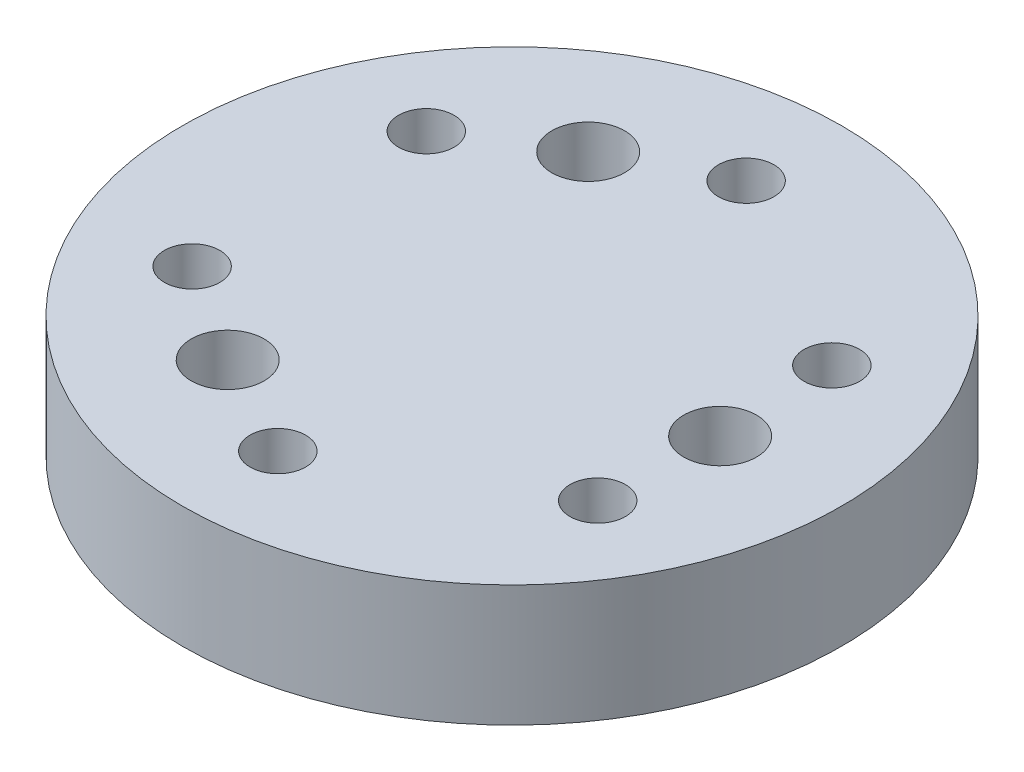
ISO-10303-21;
HEADER;
FILE_DESCRIPTION(('STEP AP214'),'2;1');
FILE_NAME('part.step','',(''),(''),'','','');
FILE_SCHEMA(('AUTOMOTIVE_DESIGN { 1 0 10303 214 1 1 1 1 }'));
ENDSEC;
DATA;
#1=APPLICATION_CONTEXT('core data for automotive mechanical design processes');
#2=APPLICATION_PROTOCOL_DEFINITION('international standard','automotive_design',2000,#1);
#3=PRODUCT_CONTEXT('',#1,'mechanical');
#4=PRODUCT('Part','Part','',(#3));
#5=PRODUCT_RELATED_PRODUCT_CATEGORY('part','',(#4));
#6=PRODUCT_DEFINITION_FORMATION('','',#4);
#7=PRODUCT_DEFINITION_CONTEXT('part definition',#1,'design');
#8=PRODUCT_DEFINITION('design','',#6,#7);
#9=PRODUCT_DEFINITION_SHAPE('','',#8);
#10=(LENGTH_UNIT() NAMED_UNIT(*) SI_UNIT(.MILLI.,.METRE.));
#11=(NAMED_UNIT(*) PLANE_ANGLE_UNIT() SI_UNIT($,.RADIAN.));
#12=(NAMED_UNIT(*) SI_UNIT($,.STERADIAN.) SOLID_ANGLE_UNIT());
#13=UNCERTAINTY_MEASURE_WITH_UNIT(LENGTH_MEASURE(1.E-05),#10,'distance_accuracy_value','');
#14=(GEOMETRIC_REPRESENTATION_CONTEXT(3) GLOBAL_UNCERTAINTY_ASSIGNED_CONTEXT((#13)) GLOBAL_UNIT_ASSIGNED_CONTEXT((#10,
#11,#12)) REPRESENTATION_CONTEXT('',''));
#15=CARTESIAN_POINT('',(0.,0.,0.));
#16=DIRECTION('',(0.,0.,1.));
#17=DIRECTION('',(1.,0.,0.));
#18=AXIS2_PLACEMENT_3D('',#15,#16,#17);
#19=CARTESIAN_POINT('',(0.,0.,0.));
#20=DIRECTION('',(0.,1.,0.));
#21=DIRECTION('',(0.,0.,1.));
#22=AXIS2_PLACEMENT_3D('',#19,#20,#21);
#23=PLANE('',#22);
#24=CARTESIAN_POINT('',(0.,0.,0.));
#25=DIRECTION('',(0.,1.,0.));
#26=DIRECTION('',(0.,0.,1.));
#27=AXIS2_PLACEMENT_3D('',#24,#25,#26);
#28=CIRCLE('',#27,19.);
#29=CARTESIAN_POINT('',(0.,0.,19.));
#30=VERTEX_POINT('',#29);
#31=EDGE_CURVE('E10',#30,#30,#28,.T.);
#32=ORIENTED_EDGE('',*,*,#31,.F.);
#33=EDGE_LOOP('',(#32));
#34=FACE_BOUND('',#33,.T.);
#35=CARTESIAN_POINT('',(0.,0.,0.));
#36=DIRECTION('',(0.,1.,0.));
#37=DIRECTION('',(0.,0.,1.));
#38=AXIS2_PLACEMENT_3D('',#35,#36,#37);
#39=CIRCLE('',#38,17.6);
#40=CARTESIAN_POINT('',(0.,0.,17.6));
#41=VERTEX_POINT('',#40);
#42=EDGE_CURVE('E46',#41,#41,#39,.T.);
#43=ORIENTED_EDGE('',*,*,#42,.T.);
#44=EDGE_LOOP('',(#43));
#45=FACE_BOUND('',#44,.T.);
#46=ADVANCED_FACE('F39',(#34,#45),#23,.F.);
#47=CARTESIAN_POINT('',(0.,3.,0.));
#48=DIRECTION('',(0.,-1.,0.));
#49=DIRECTION('',(0.,0.,-1.));
#50=AXIS2_PLACEMENT_3D('',#47,#48,#49);
#51=CYLINDRICAL_SURFACE('',#50,19.);
#52=ORIENTED_EDGE('',*,*,#31,.T.);
#53=EDGE_LOOP('',(#52));
#54=FACE_BOUND('',#53,.T.);
#55=CARTESIAN_POINT('',(0.,7.,0.));
#56=DIRECTION('',(0.,1.,0.));
#57=DIRECTION('',(0.,0.,1.));
#58=AXIS2_PLACEMENT_3D('',#55,#56,#57);
#59=CIRCLE('',#58,19.);
#60=CARTESIAN_POINT('',(0.,7.,19.));
#61=VERTEX_POINT('',#60);
#62=EDGE_CURVE('E54',#61,#61,#59,.T.);
#63=ORIENTED_EDGE('',*,*,#62,.F.);
#64=EDGE_LOOP('',(#63));
#65=FACE_BOUND('',#64,.T.);
#66=ADVANCED_FACE('F41',(#54,#65),#51,.T.);
#67=CARTESIAN_POINT('',(0.,3.,0.));
#68=DIRECTION('',(0.,-1.,0.));
#69=DIRECTION('',(0.,0.,-1.));
#70=AXIS2_PLACEMENT_3D('',#67,#68,#69);
#71=CYLINDRICAL_SURFACE('',#70,17.6);
#72=CARTESIAN_POINT('',(0.,3.,0.));
#73=DIRECTION('',(0.,1.,0.));
#74=DIRECTION('',(0.,0.,1.));
#75=AXIS2_PLACEMENT_3D('',#72,#73,#74);
#76=CIRCLE('',#75,17.6);
#77=CARTESIAN_POINT('',(0.,3.,17.6));
#78=VERTEX_POINT('',#77);
#79=EDGE_CURVE('E50',#78,#78,#76,.T.);
#80=ORIENTED_EDGE('',*,*,#79,.T.);
#81=EDGE_LOOP('',(#80));
#82=FACE_BOUND('',#81,.T.);
#83=ORIENTED_EDGE('',*,*,#42,.F.);
#84=EDGE_LOOP('',(#83));
#85=FACE_BOUND('',#84,.T.);
#86=ADVANCED_FACE('F129',(#82,#85),#71,.F.);
#87=CARTESIAN_POINT('',(0.,3.,0.));
#88=DIRECTION('',(0.,1.,0.));
#89=DIRECTION('',(0.,0.,1.));
#90=AXIS2_PLACEMENT_3D('',#87,#88,#89);
#91=PLANE('',#90);
#92=CARTESIAN_POINT('',(-5.99999999999991,3.,-10.3923048454133));
#93=DIRECTION('',(0.,1.,0.));
#94=DIRECTION('',(0.,0.,1.));
#95=AXIS2_PLACEMENT_3D('',#92,#93,#94);
#96=CIRCLE('',#95,2.1);
#97=CARTESIAN_POINT('',(-5.99999999999991,3.,-8.29230484541332));
#98=VERTEX_POINT('',#97);
#99=EDGE_CURVE('E59',#98,#98,#96,.T.);
#100=ORIENTED_EDGE('',*,*,#99,.T.);
#101=EDGE_LOOP('',(#100));
#102=FACE_BOUND('',#101,.T.);
#103=CARTESIAN_POINT('',(-6.00000000000005,3.,10.3923048454132));
#104=DIRECTION('',(0.,1.,0.));
#105=DIRECTION('',(0.,0.,1.));
#106=AXIS2_PLACEMENT_3D('',#103,#104,#105);
#107=CIRCLE('',#106,2.1);
#108=CARTESIAN_POINT('',(-6.00000000000005,3.,12.4923048454132));
#109=VERTEX_POINT('',#108);
#110=EDGE_CURVE('E62',#109,#109,#107,.T.);
#111=ORIENTED_EDGE('',*,*,#110,.T.);
#112=EDGE_LOOP('',(#111));
#113=FACE_BOUND('',#112,.T.);
#114=CARTESIAN_POINT('',(-11.6913429510898,3.,-6.75000000000014));
#115=DIRECTION('',(0.,1.,0.));
#116=DIRECTION('',(0.,0.,1.));
#117=AXIS2_PLACEMENT_3D('',#114,#115,#116);
#118=CIRCLE('',#117,1.6);
#119=CARTESIAN_POINT('',(-11.6913429510898,3.,-5.15000000000014));
#120=VERTEX_POINT('',#119);
#121=EDGE_CURVE('E65',#120,#120,#118,.T.);
#122=ORIENTED_EDGE('',*,*,#121,.T.);
#123=EDGE_LOOP('',(#122));
#124=FACE_BOUND('',#123,.T.);
#125=CARTESIAN_POINT('',(-11.69134295109,3.,6.74999999999989));
#126=DIRECTION('',(0.,1.,0.));
#127=DIRECTION('',(0.,0.,1.));
#128=AXIS2_PLACEMENT_3D('',#125,#126,#127);
#129=CIRCLE('',#128,1.6);
#130=CARTESIAN_POINT('',(-11.69134295109,3.,8.34999999999989));
#131=VERTEX_POINT('',#130);
#132=EDGE_CURVE('E68',#131,#131,#129,.T.);
#133=ORIENTED_EDGE('',*,*,#132,.T.);
#134=EDGE_LOOP('',(#133));
#135=FACE_BOUND('',#134,.T.);
#136=CARTESIAN_POINT('',(0.,3.,13.5));
#137=DIRECTION('',(0.,1.,0.));
#138=DIRECTION('',(0.,0.,1.));
#139=AXIS2_PLACEMENT_3D('',#136,#137,#138);
#140=CIRCLE('',#139,1.6);
#141=CARTESIAN_POINT('',(0.,3.,15.1));
#142=VERTEX_POINT('',#141);
#143=EDGE_CURVE('E71',#142,#142,#140,.T.);
#144=ORIENTED_EDGE('',*,*,#143,.T.);
#145=EDGE_LOOP('',(#144));
#146=FACE_BOUND('',#145,.T.);
#147=CARTESIAN_POINT('',(11.6913429510899,3.,6.75000000000005));
#148=DIRECTION('',(0.,1.,0.));
#149=DIRECTION('',(0.,0.,1.));
#150=AXIS2_PLACEMENT_3D('',#147,#148,#149);
#151=CIRCLE('',#150,1.6);
#152=CARTESIAN_POINT('',(11.6913429510899,3.,8.35000000000006));
#153=VERTEX_POINT('',#152);
#154=EDGE_CURVE('E74',#153,#153,#151,.T.);
#155=ORIENTED_EDGE('',*,*,#154,.T.);
#156=EDGE_LOOP('',(#155));
#157=FACE_BOUND('',#156,.T.);
#158=CARTESIAN_POINT('',(11.6913429510899,3.,-6.74999999999997));
#159=DIRECTION('',(0.,1.,0.));
#160=DIRECTION('',(0.,0.,1.));
#161=AXIS2_PLACEMENT_3D('',#158,#159,#160);
#162=CIRCLE('',#161,1.6);
#163=CARTESIAN_POINT('',(11.6913429510899,3.,-5.14999999999997));
#164=VERTEX_POINT('',#163);
#165=EDGE_CURVE('E77',#164,#164,#162,.T.);
#166=ORIENTED_EDGE('',*,*,#165,.T.);
#167=EDGE_LOOP('',(#166));
#168=FACE_BOUND('',#167,.T.);
#169=CARTESIAN_POINT('',(12.,3.,0.));
#170=DIRECTION('',(0.,1.,0.));
#171=DIRECTION('',(0.,0.,1.));
#172=AXIS2_PLACEMENT_3D('',#169,#170,#171);
#173=CIRCLE('',#172,2.1);
#174=CARTESIAN_POINT('',(12.,3.,2.1));
#175=VERTEX_POINT('',#174);
#176=EDGE_CURVE('E80',#175,#175,#173,.T.);
#177=ORIENTED_EDGE('',*,*,#176,.T.);
#178=EDGE_LOOP('',(#177));
#179=FACE_BOUND('',#178,.T.);
#180=CARTESIAN_POINT('',(0.,3.,-13.5));
#181=DIRECTION('',(0.,1.,0.));
#182=DIRECTION('',(0.,0.,1.));
#183=AXIS2_PLACEMENT_3D('',#180,#181,#182);
#184=CIRCLE('',#183,1.6);
#185=CARTESIAN_POINT('',(0.,3.,-11.9));
#186=VERTEX_POINT('',#185);
#187=EDGE_CURVE('E83',#186,#186,#184,.T.);
#188=ORIENTED_EDGE('',*,*,#187,.T.);
#189=EDGE_LOOP('',(#188));
#190=FACE_BOUND('',#189,.T.);
#191=ORIENTED_EDGE('',*,*,#79,.F.);
#192=EDGE_LOOP('',(#191));
#193=FACE_BOUND('',#192,.T.);
#194=ADVANCED_FACE('F121',(#102,#113,#124,#135,#146,#157,#168,#179,#190,#193),#91,.F.);
#195=CARTESIAN_POINT('',(0.,7.,0.));
#196=DIRECTION('',(0.,1.,0.));
#197=DIRECTION('',(0.,0.,1.));
#198=AXIS2_PLACEMENT_3D('',#195,#196,#197);
#199=PLANE('',#198);
#200=CARTESIAN_POINT('',(-5.99999999999991,7.,-10.3923048454133));
#201=DIRECTION('',(0.,1.,0.));
#202=DIRECTION('',(0.,0.,1.));
#203=AXIS2_PLACEMENT_3D('',#200,#201,#202);
#204=CIRCLE('',#203,2.1);
#205=CARTESIAN_POINT('',(-5.99999999999991,7.,-8.29230484541332));
#206=VERTEX_POINT('',#205);
#207=EDGE_CURVE('E90',#206,#206,#204,.T.);
#208=ORIENTED_EDGE('',*,*,#207,.F.);
#209=EDGE_LOOP('',(#208));
#210=FACE_BOUND('',#209,.T.);
#211=CARTESIAN_POINT('',(-6.00000000000005,7.,10.3923048454132));
#212=DIRECTION('',(0.,1.,0.));
#213=DIRECTION('',(0.,0.,1.));
#214=AXIS2_PLACEMENT_3D('',#211,#212,#213);
#215=CIRCLE('',#214,2.1);
#216=CARTESIAN_POINT('',(-6.00000000000005,7.,12.4923048454132));
#217=VERTEX_POINT('',#216);
#218=EDGE_CURVE('E93',#217,#217,#215,.T.);
#219=ORIENTED_EDGE('',*,*,#218,.F.);
#220=EDGE_LOOP('',(#219));
#221=FACE_BOUND('',#220,.T.);
#222=CARTESIAN_POINT('',(-11.6913429510898,7.,-6.75000000000014));
#223=DIRECTION('',(0.,1.,0.));
#224=DIRECTION('',(0.,0.,1.));
#225=AXIS2_PLACEMENT_3D('',#222,#223,#224);
#226=CIRCLE('',#225,1.6);
#227=CARTESIAN_POINT('',(-11.6913429510898,7.,-5.15000000000014));
#228=VERTEX_POINT('',#227);
#229=EDGE_CURVE('E96',#228,#228,#226,.T.);
#230=ORIENTED_EDGE('',*,*,#229,.F.);
#231=EDGE_LOOP('',(#230));
#232=FACE_BOUND('',#231,.T.);
#233=CARTESIAN_POINT('',(-11.69134295109,7.,6.74999999999989));
#234=DIRECTION('',(0.,1.,0.));
#235=DIRECTION('',(0.,0.,1.));
#236=AXIS2_PLACEMENT_3D('',#233,#234,#235);
#237=CIRCLE('',#236,1.6);
#238=CARTESIAN_POINT('',(-11.69134295109,7.,8.34999999999989));
#239=VERTEX_POINT('',#238);
#240=EDGE_CURVE('E99',#239,#239,#237,.T.);
#241=ORIENTED_EDGE('',*,*,#240,.F.);
#242=EDGE_LOOP('',(#241));
#243=FACE_BOUND('',#242,.T.);
#244=CARTESIAN_POINT('',(0.,7.,13.5));
#245=DIRECTION('',(0.,1.,0.));
#246=DIRECTION('',(0.,0.,1.));
#247=AXIS2_PLACEMENT_3D('',#244,#245,#246);
#248=CIRCLE('',#247,1.6);
#249=CARTESIAN_POINT('',(0.,7.,15.1));
#250=VERTEX_POINT('',#249);
#251=EDGE_CURVE('E102',#250,#250,#248,.T.);
#252=ORIENTED_EDGE('',*,*,#251,.F.);
#253=EDGE_LOOP('',(#252));
#254=FACE_BOUND('',#253,.T.);
#255=CARTESIAN_POINT('',(11.6913429510899,7.,6.75000000000005));
#256=DIRECTION('',(0.,1.,0.));
#257=DIRECTION('',(0.,0.,1.));
#258=AXIS2_PLACEMENT_3D('',#255,#256,#257);
#259=CIRCLE('',#258,1.6);
#260=CARTESIAN_POINT('',(11.6913429510899,7.,8.35000000000006));
#261=VERTEX_POINT('',#260);
#262=EDGE_CURVE('E105',#261,#261,#259,.T.);
#263=ORIENTED_EDGE('',*,*,#262,.F.);
#264=EDGE_LOOP('',(#263));
#265=FACE_BOUND('',#264,.T.);
#266=CARTESIAN_POINT('',(11.6913429510899,7.,-6.74999999999997));
#267=DIRECTION('',(0.,1.,0.));
#268=DIRECTION('',(0.,0.,1.));
#269=AXIS2_PLACEMENT_3D('',#266,#267,#268);
#270=CIRCLE('',#269,1.6);
#271=CARTESIAN_POINT('',(11.6913429510899,7.,-5.14999999999997));
#272=VERTEX_POINT('',#271);
#273=EDGE_CURVE('E108',#272,#272,#270,.T.);
#274=ORIENTED_EDGE('',*,*,#273,.F.);
#275=EDGE_LOOP('',(#274));
#276=FACE_BOUND('',#275,.T.);
#277=CARTESIAN_POINT('',(12.,7.,0.));
#278=DIRECTION('',(0.,1.,0.));
#279=DIRECTION('',(0.,0.,1.));
#280=AXIS2_PLACEMENT_3D('',#277,#278,#279);
#281=CIRCLE('',#280,2.1);
#282=CARTESIAN_POINT('',(12.,7.,2.1));
#283=VERTEX_POINT('',#282);
#284=EDGE_CURVE('E89',#283,#283,#281,.T.);
#285=ORIENTED_EDGE('',*,*,#284,.F.);
#286=EDGE_LOOP('',(#285));
#287=FACE_BOUND('',#286,.T.);
#288=CARTESIAN_POINT('',(0.,7.,-13.5));
#289=DIRECTION('',(0.,1.,0.));
#290=DIRECTION('',(0.,0.,1.));
#291=AXIS2_PLACEMENT_3D('',#288,#289,#290);
#292=CIRCLE('',#291,1.6);
#293=CARTESIAN_POINT('',(0.,7.,-11.9));
#294=VERTEX_POINT('',#293);
#295=EDGE_CURVE('E86',#294,#294,#292,.T.);
#296=ORIENTED_EDGE('',*,*,#295,.F.);
#297=EDGE_LOOP('',(#296));
#298=FACE_BOUND('',#297,.T.);
#299=ORIENTED_EDGE('',*,*,#62,.T.);
#300=EDGE_LOOP('',(#299));
#301=FACE_BOUND('',#300,.T.);
#302=ADVANCED_FACE('F117',(#210,#221,#232,#243,#254,#265,#276,#287,#298,#301),#199,.T.);
#303=CARTESIAN_POINT('',(0.,0.,-13.5));
#304=DIRECTION('',(0.,1.,0.));
#305=DIRECTION('',(0.,0.,1.));
#306=AXIS2_PLACEMENT_3D('',#303,#304,#305);
#307=CYLINDRICAL_SURFACE('',#306,1.6);
#308=ORIENTED_EDGE('',*,*,#295,.T.);
#309=EDGE_LOOP('',(#308));
#310=FACE_BOUND('',#309,.T.);
#311=ORIENTED_EDGE('',*,*,#187,.F.);
#312=EDGE_LOOP('',(#311));
#313=FACE_BOUND('',#312,.T.);
#314=ADVANCED_FACE('F120',(#310,#313),#307,.F.);
#315=CARTESIAN_POINT('',(12.,0.,0.));
#316=DIRECTION('',(0.,1.,0.));
#317=DIRECTION('',(0.,0.,1.));
#318=AXIS2_PLACEMENT_3D('',#315,#316,#317);
#319=CYLINDRICAL_SURFACE('',#318,2.1);
#320=ORIENTED_EDGE('',*,*,#284,.T.);
#321=EDGE_LOOP('',(#320));
#322=FACE_BOUND('',#321,.T.);
#323=ORIENTED_EDGE('',*,*,#176,.F.);
#324=EDGE_LOOP('',(#323));
#325=FACE_BOUND('',#324,.T.);
#326=ADVANCED_FACE('F114',(#322,#325),#319,.F.);
#327=CARTESIAN_POINT('',(11.6913429510899,0.,-6.74999999999997));
#328=DIRECTION('',(0.,1.,0.));
#329=DIRECTION('',(0.,0.,1.));
#330=AXIS2_PLACEMENT_3D('',#327,#328,#329);
#331=CYLINDRICAL_SURFACE('',#330,1.6);
#332=ORIENTED_EDGE('',*,*,#273,.T.);
#333=EDGE_LOOP('',(#332));
#334=FACE_BOUND('',#333,.T.);
#335=ORIENTED_EDGE('',*,*,#165,.F.);
#336=EDGE_LOOP('',(#335));
#337=FACE_BOUND('',#336,.T.);
#338=ADVANCED_FACE('F169',(#334,#337),#331,.F.);
#339=CARTESIAN_POINT('',(11.6913429510899,0.,6.75000000000005));
#340=DIRECTION('',(0.,1.,0.));
#341=DIRECTION('',(0.,0.,1.));
#342=AXIS2_PLACEMENT_3D('',#339,#340,#341);
#343=CYLINDRICAL_SURFACE('',#342,1.6);
#344=ORIENTED_EDGE('',*,*,#262,.T.);
#345=EDGE_LOOP('',(#344));
#346=FACE_BOUND('',#345,.T.);
#347=ORIENTED_EDGE('',*,*,#154,.F.);
#348=EDGE_LOOP('',(#347));
#349=FACE_BOUND('',#348,.T.);
#350=ADVANCED_FACE('F165',(#346,#349),#343,.F.);
#351=CARTESIAN_POINT('',(0.,0.,13.5));
#352=DIRECTION('',(0.,1.,0.));
#353=DIRECTION('',(0.,0.,1.));
#354=AXIS2_PLACEMENT_3D('',#351,#352,#353);
#355=CYLINDRICAL_SURFACE('',#354,1.6);
#356=ORIENTED_EDGE('',*,*,#251,.T.);
#357=EDGE_LOOP('',(#356));
#358=FACE_BOUND('',#357,.T.);
#359=ORIENTED_EDGE('',*,*,#143,.F.);
#360=EDGE_LOOP('',(#359));
#361=FACE_BOUND('',#360,.T.);
#362=ADVANCED_FACE('F161',(#358,#361),#355,.F.);
#363=CARTESIAN_POINT('',(-11.69134295109,0.,6.74999999999989));
#364=DIRECTION('',(0.,1.,0.));
#365=DIRECTION('',(0.,0.,1.));
#366=AXIS2_PLACEMENT_3D('',#363,#364,#365);
#367=CYLINDRICAL_SURFACE('',#366,1.6);
#368=ORIENTED_EDGE('',*,*,#240,.T.);
#369=EDGE_LOOP('',(#368));
#370=FACE_BOUND('',#369,.T.);
#371=ORIENTED_EDGE('',*,*,#132,.F.);
#372=EDGE_LOOP('',(#371));
#373=FACE_BOUND('',#372,.T.);
#374=ADVANCED_FACE('F157',(#370,#373),#367,.F.);
#375=CARTESIAN_POINT('',(-11.6913429510898,0.,-6.75000000000014));
#376=DIRECTION('',(0.,1.,0.));
#377=DIRECTION('',(0.,0.,1.));
#378=AXIS2_PLACEMENT_3D('',#375,#376,#377);
#379=CYLINDRICAL_SURFACE('',#378,1.6);
#380=ORIENTED_EDGE('',*,*,#229,.T.);
#381=EDGE_LOOP('',(#380));
#382=FACE_BOUND('',#381,.T.);
#383=ORIENTED_EDGE('',*,*,#121,.F.);
#384=EDGE_LOOP('',(#383));
#385=FACE_BOUND('',#384,.T.);
#386=ADVANCED_FACE('F153',(#382,#385),#379,.F.);
#387=CARTESIAN_POINT('',(-6.00000000000005,0.,10.3923048454132));
#388=DIRECTION('',(0.,1.,0.));
#389=DIRECTION('',(0.,0.,1.));
#390=AXIS2_PLACEMENT_3D('',#387,#388,#389);
#391=CYLINDRICAL_SURFACE('',#390,2.1);
#392=ORIENTED_EDGE('',*,*,#218,.T.);
#393=EDGE_LOOP('',(#392));
#394=FACE_BOUND('',#393,.T.);
#395=ORIENTED_EDGE('',*,*,#110,.F.);
#396=EDGE_LOOP('',(#395));
#397=FACE_BOUND('',#396,.T.);
#398=ADVANCED_FACE('F149',(#394,#397),#391,.F.);
#399=CARTESIAN_POINT('',(-5.99999999999991,0.,-10.3923048454133));
#400=DIRECTION('',(0.,1.,0.));
#401=DIRECTION('',(0.,0.,1.));
#402=AXIS2_PLACEMENT_3D('',#399,#400,#401);
#403=CYLINDRICAL_SURFACE('',#402,2.1);
#404=ORIENTED_EDGE('',*,*,#207,.T.);
#405=EDGE_LOOP('',(#404));
#406=FACE_BOUND('',#405,.T.);
#407=ORIENTED_EDGE('',*,*,#99,.F.);
#408=EDGE_LOOP('',(#407));
#409=FACE_BOUND('',#408,.T.);
#410=ADVANCED_FACE('F146',(#406,#409),#403,.F.);
#411=CLOSED_SHELL('',(#46,#66,#86,#194,#302,#314,#326,#338,#350,#362,#374,#386,#398,#410));
#412=MANIFOLD_SOLID_BREP('B2',#411);
#413=ADVANCED_BREP_SHAPE_REPRESENTATION('',(#18,#412),#14);
#414=SHAPE_DEFINITION_REPRESENTATION(#9,#413);
ENDSEC;
END-ISO-10303-21;
